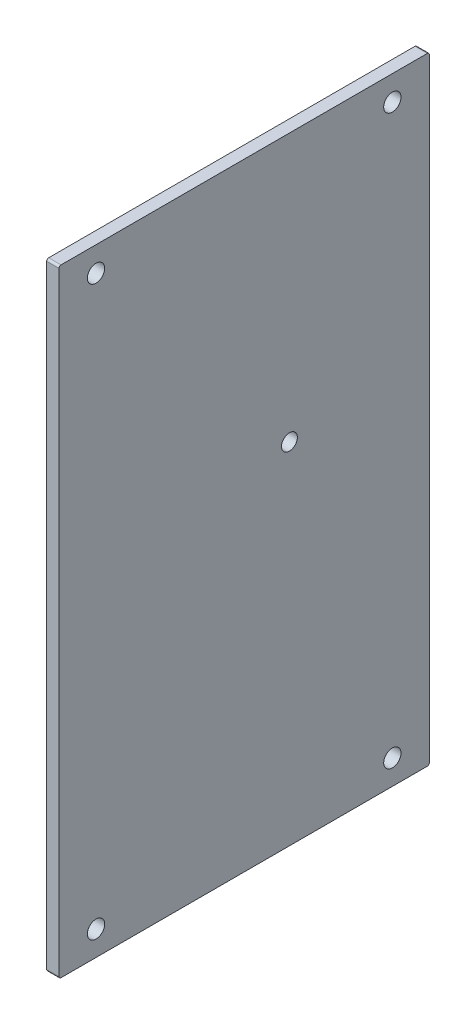
ISO-10303-21;
HEADER;
FILE_DESCRIPTION(('STEP AP214'),'2;1');
FILE_NAME('part.step','',(''),(''),'','','');
FILE_SCHEMA(('AUTOMOTIVE_DESIGN { 1 0 10303 214 1 1 1 1 }'));
ENDSEC;
DATA;
#1=APPLICATION_CONTEXT('core data for automotive mechanical design processes');
#2=APPLICATION_PROTOCOL_DEFINITION('international standard','automotive_design',2000,#1);
#3=PRODUCT_CONTEXT('',#1,'mechanical');
#4=PRODUCT('Part','Part','',(#3));
#5=PRODUCT_RELATED_PRODUCT_CATEGORY('part','',(#4));
#6=PRODUCT_DEFINITION_FORMATION('','',#4);
#7=PRODUCT_DEFINITION_CONTEXT('part definition',#1,'design');
#8=PRODUCT_DEFINITION('design','',#6,#7);
#9=PRODUCT_DEFINITION_SHAPE('','',#8);
#10=(LENGTH_UNIT() NAMED_UNIT(*) SI_UNIT(.MILLI.,.METRE.));
#11=(NAMED_UNIT(*) PLANE_ANGLE_UNIT() SI_UNIT($,.RADIAN.));
#12=(NAMED_UNIT(*) SI_UNIT($,.STERADIAN.) SOLID_ANGLE_UNIT());
#13=UNCERTAINTY_MEASURE_WITH_UNIT(LENGTH_MEASURE(1.E-05),#10,'distance_accuracy_value','');
#14=(GEOMETRIC_REPRESENTATION_CONTEXT(3) GLOBAL_UNCERTAINTY_ASSIGNED_CONTEXT((#13)) GLOBAL_UNIT_ASSIGNED_CONTEXT((#10,
#11,#12)) REPRESENTATION_CONTEXT('',''));
#15=CARTESIAN_POINT('',(0.,0.,0.));
#16=DIRECTION('',(0.,0.,1.));
#17=DIRECTION('',(1.,0.,0.));
#18=AXIS2_PLACEMENT_3D('',#15,#16,#17);
#19=CARTESIAN_POINT('',(3.,0.,0.));
#20=DIRECTION('',(1.,0.,0.));
#21=DIRECTION('',(0.,0.,-1.));
#22=AXIS2_PLACEMENT_3D('',#19,#20,#21);
#23=PLANE('',#22);
#24=CARTESIAN_POINT('',(3.,-144.,-81.));
#25=DIRECTION('',(1.,0.,0.));
#26=DIRECTION('',(0.,0.,-1.));
#27=AXIS2_PLACEMENT_3D('',#24,#25,#26);
#28=CIRCLE('',#27,2.09999999999999);
#29=CARTESIAN_POINT('',(3.,-144.,-83.1));
#30=VERTEX_POINT('',#29);
#31=EDGE_CURVE('E195',#30,#30,#28,.T.);
#32=ORIENTED_EDGE('',*,*,#31,.F.);
#33=EDGE_LOOP('',(#32));
#34=FACE_BOUND('',#33,.T.);
#35=CARTESIAN_POINT('',(3.,-6.,-9.));
#36=DIRECTION('',(1.,0.,0.));
#37=DIRECTION('',(0.,0.,-1.));
#38=AXIS2_PLACEMENT_3D('',#35,#36,#37);
#39=CIRCLE('',#38,2.1);
#40=CARTESIAN_POINT('',(3.,-6.,-11.1));
#41=VERTEX_POINT('',#40);
#42=EDGE_CURVE('E184',#41,#41,#39,.T.);
#43=ORIENTED_EDGE('',*,*,#42,.F.);
#44=EDGE_LOOP('',(#43));
#45=FACE_BOUND('',#44,.T.);
#46=DIRECTION('',(0.,0.,-1.));
#47=VECTOR('',#46,1.);
#48=CARTESIAN_POINT('',(3.,-150.,0.));
#49=LINE('',#48,#47);
#50=CARTESIAN_POINT('',(3.,-150.,-0.500000000000018));
#51=VERTEX_POINT('',#50);
#52=CARTESIAN_POINT('',(3.,-150.,-89.5));
#53=VERTEX_POINT('',#52);
#54=EDGE_CURVE('E169',#51,#53,#49,.T.);
#55=ORIENTED_EDGE('',*,*,#54,.T.);
#56=CARTESIAN_POINT('',(3.,-149.5,-89.5));
#57=DIRECTION('',(1.,0.,0.));
#58=DIRECTION('',(0.,0.,-1.));
#59=AXIS2_PLACEMENT_3D('',#56,#57,#58);
#60=CIRCLE('',#59,0.5);
#61=CARTESIAN_POINT('',(3.,-149.5,-90.));
#62=VERTEX_POINT('',#61);
#63=EDGE_CURVE('E149',#53,#62,#60,.T.);
#64=ORIENTED_EDGE('',*,*,#63,.T.);
#65=DIRECTION('',(0.,1.,0.));
#66=VECTOR('',#65,1.);
#67=CARTESIAN_POINT('',(3.,0.,-90.));
#68=LINE('',#67,#66);
#69=CARTESIAN_POINT('',(3.,-0.5,-90.));
#70=VERTEX_POINT('',#69);
#71=EDGE_CURVE('E119',#62,#70,#68,.T.);
#72=ORIENTED_EDGE('',*,*,#71,.T.);
#73=CARTESIAN_POINT('',(3.,-0.5,-89.5));
#74=DIRECTION('',(1.,0.,0.));
#75=DIRECTION('',(0.,0.,-1.));
#76=AXIS2_PLACEMENT_3D('',#73,#74,#75);
#77=CIRCLE('',#76,0.5);
#78=CARTESIAN_POINT('',(3.,0.,-89.5));
#79=VERTEX_POINT('',#78);
#80=EDGE_CURVE('E55',#70,#79,#77,.T.);
#81=ORIENTED_EDGE('',*,*,#80,.T.);
#82=DIRECTION('',(0.,0.,1.));
#83=VECTOR('',#82,1.);
#84=CARTESIAN_POINT('',(3.,0.,0.));
#85=LINE('',#84,#83);
#86=CARTESIAN_POINT('',(3.,0.,-0.5));
#87=VERTEX_POINT('',#86);
#88=EDGE_CURVE('E136',#79,#87,#85,.T.);
#89=ORIENTED_EDGE('',*,*,#88,.T.);
#90=CARTESIAN_POINT('',(3.,-0.5,-0.5));
#91=DIRECTION('',(1.,0.,0.));
#92=DIRECTION('',(0.,0.,-1.));
#93=AXIS2_PLACEMENT_3D('',#90,#91,#92);
#94=CIRCLE('',#93,0.5);
#95=CARTESIAN_POINT('',(3.,-0.5,0.));
#96=VERTEX_POINT('',#95);
#97=EDGE_CURVE('E144',#87,#96,#94,.T.);
#98=ORIENTED_EDGE('',*,*,#97,.T.);
#99=DIRECTION('',(0.,-1.,0.));
#100=VECTOR('',#99,1.);
#101=CARTESIAN_POINT('',(3.,0.,0.));
#102=LINE('',#101,#100);
#103=CARTESIAN_POINT('',(3.,-149.5,0.));
#104=VERTEX_POINT('',#103);
#105=EDGE_CURVE('E130',#96,#104,#102,.T.);
#106=ORIENTED_EDGE('',*,*,#105,.T.);
#107=CARTESIAN_POINT('',(3.,-149.5,-0.500000000000018));
#108=DIRECTION('',(1.,0.,0.));
#109=DIRECTION('',(0.,0.,-1.));
#110=AXIS2_PLACEMENT_3D('',#107,#108,#109);
#111=CIRCLE('',#110,0.5);
#112=EDGE_CURVE('E147',#104,#51,#111,.T.);
#113=ORIENTED_EDGE('',*,*,#112,.T.);
#114=EDGE_LOOP('',(#55,#64,#72,#81,#89,#98,#106,#113));
#115=FACE_BOUND('',#114,.T.);
#116=CARTESIAN_POINT('',(3.,-65.,-56.));
#117=DIRECTION('',(1.,0.,0.));
#118=DIRECTION('',(0.,0.,-1.));
#119=AXIS2_PLACEMENT_3D('',#116,#117,#118);
#120=CIRCLE('',#119,1.925);
#121=CARTESIAN_POINT('',(3.,-65.,-57.925));
#122=VERTEX_POINT('',#121);
#123=EDGE_CURVE('E175',#122,#122,#120,.T.);
#124=ORIENTED_EDGE('',*,*,#123,.F.);
#125=EDGE_LOOP('',(#124));
#126=FACE_BOUND('',#125,.T.);
#127=CARTESIAN_POINT('',(3.,-5.99999999999999,-81.));
#128=DIRECTION('',(1.,0.,0.));
#129=DIRECTION('',(0.,0.,1.));
#130=AXIS2_PLACEMENT_3D('',#127,#128,#129);
#131=CIRCLE('',#130,2.09999999999999);
#132=CARTESIAN_POINT('',(3.,-5.99999999999999,-78.9));
#133=VERTEX_POINT('',#132);
#134=EDGE_CURVE('E189',#133,#133,#131,.T.);
#135=ORIENTED_EDGE('',*,*,#134,.F.);
#136=EDGE_LOOP('',(#135));
#137=FACE_BOUND('',#136,.T.);
#138=CARTESIAN_POINT('',(3.,-144.,-9.));
#139=DIRECTION('',(1.,0.,0.));
#140=DIRECTION('',(0.,0.,1.));
#141=AXIS2_PLACEMENT_3D('',#138,#139,#140);
#142=CIRCLE('',#141,2.09999999999999);
#143=CARTESIAN_POINT('',(3.,-144.,-6.90000000000001));
#144=VERTEX_POINT('',#143);
#145=EDGE_CURVE('E201',#144,#144,#142,.T.);
#146=ORIENTED_EDGE('',*,*,#145,.F.);
#147=EDGE_LOOP('',(#146));
#148=FACE_BOUND('',#147,.T.);
#149=ADVANCED_FACE('F34',(#34,#45,#115,#126,#137,#148),#23,.T.);
#150=CARTESIAN_POINT('',(0.,0.,0.));
#151=DIRECTION('',(1.,0.,0.));
#152=DIRECTION('',(0.,0.,-1.));
#153=AXIS2_PLACEMENT_3D('',#150,#151,#152);
#154=PLANE('',#153);
#155=DIRECTION('',(0.,1.,0.));
#156=VECTOR('',#155,1.);
#157=CARTESIAN_POINT('',(0.,0.,-90.));
#158=LINE('',#157,#156);
#159=CARTESIAN_POINT('',(0.,-149.5,-90.));
#160=VERTEX_POINT('',#159);
#161=CARTESIAN_POINT('',(0.,-0.5,-90.));
#162=VERTEX_POINT('',#161);
#163=EDGE_CURVE('E117',#160,#162,#158,.T.);
#164=ORIENTED_EDGE('',*,*,#163,.F.);
#165=CARTESIAN_POINT('',(0.,-149.5,-89.5));
#166=DIRECTION('',(1.,0.,0.));
#167=DIRECTION('',(0.,0.,-1.));
#168=AXIS2_PLACEMENT_3D('',#165,#166,#167);
#169=CIRCLE('',#168,0.5);
#170=CARTESIAN_POINT('',(0.,-150.,-89.5));
#171=VERTEX_POINT('',#170);
#172=EDGE_CURVE('E100',#160,#171,#169,.F.);
#173=ORIENTED_EDGE('',*,*,#172,.T.);
#174=DIRECTION('',(0.,0.,-1.));
#175=VECTOR('',#174,1.);
#176=CARTESIAN_POINT('',(0.,-150.,0.));
#177=LINE('',#176,#175);
#178=CARTESIAN_POINT('',(0.,-150.,-0.500000000000018));
#179=VERTEX_POINT('',#178);
#180=EDGE_CURVE('E128',#179,#171,#177,.T.);
#181=ORIENTED_EDGE('',*,*,#180,.F.);
#182=CARTESIAN_POINT('',(0.,-149.5,-0.500000000000018));
#183=DIRECTION('',(1.,0.,0.));
#184=DIRECTION('',(0.,0.,-1.));
#185=AXIS2_PLACEMENT_3D('',#182,#183,#184);
#186=CIRCLE('',#185,0.5);
#187=CARTESIAN_POINT('',(0.,-149.5,0.));
#188=VERTEX_POINT('',#187);
#189=EDGE_CURVE('E111',#179,#188,#186,.F.);
#190=ORIENTED_EDGE('',*,*,#189,.T.);
#191=DIRECTION('',(0.,-1.,0.));
#192=VECTOR('',#191,1.);
#193=CARTESIAN_POINT('',(0.,0.,0.));
#194=LINE('',#193,#192);
#195=CARTESIAN_POINT('',(0.,-0.5,0.));
#196=VERTEX_POINT('',#195);
#197=EDGE_CURVE('E132',#196,#188,#194,.T.);
#198=ORIENTED_EDGE('',*,*,#197,.F.);
#199=CARTESIAN_POINT('',(0.,-0.5,-0.5));
#200=DIRECTION('',(1.,0.,0.));
#201=DIRECTION('',(0.,0.,-1.));
#202=AXIS2_PLACEMENT_3D('',#199,#200,#201);
#203=CIRCLE('',#202,0.5);
#204=CARTESIAN_POINT('',(0.,0.,-0.5));
#205=VERTEX_POINT('',#204);
#206=EDGE_CURVE('E120',#196,#205,#203,.F.);
#207=ORIENTED_EDGE('',*,*,#206,.T.);
#208=DIRECTION('',(0.,0.,1.));
#209=VECTOR('',#208,1.);
#210=CARTESIAN_POINT('',(0.,0.,0.));
#211=LINE('',#210,#209);
#212=CARTESIAN_POINT('',(0.,0.,-89.5));
#213=VERTEX_POINT('',#212);
#214=EDGE_CURVE('E127',#213,#205,#211,.T.);
#215=ORIENTED_EDGE('',*,*,#214,.F.);
#216=CARTESIAN_POINT('',(0.,-0.5,-89.5));
#217=DIRECTION('',(1.,0.,0.));
#218=DIRECTION('',(0.,0.,-1.));
#219=AXIS2_PLACEMENT_3D('',#216,#217,#218);
#220=CIRCLE('',#219,0.5);
#221=EDGE_CURVE('E126',#213,#162,#220,.F.);
#222=ORIENTED_EDGE('',*,*,#221,.T.);
#223=EDGE_LOOP('',(#164,#173,#181,#190,#198,#207,#215,#222));
#224=FACE_BOUND('',#223,.T.);
#225=CARTESIAN_POINT('',(0.,-65.,-56.));
#226=DIRECTION('',(1.,0.,0.));
#227=DIRECTION('',(0.,0.,-1.));
#228=AXIS2_PLACEMENT_3D('',#225,#226,#227);
#229=CIRCLE('',#228,1.925);
#230=CARTESIAN_POINT('',(0.,-65.,-57.925));
#231=VERTEX_POINT('',#230);
#232=EDGE_CURVE('E177',#231,#231,#229,.T.);
#233=ORIENTED_EDGE('',*,*,#232,.T.);
#234=EDGE_LOOP('',(#233));
#235=FACE_BOUND('',#234,.T.);
#236=CARTESIAN_POINT('',(0.,-6.,-9.));
#237=DIRECTION('',(1.,0.,0.));
#238=DIRECTION('',(0.,0.,-1.));
#239=AXIS2_PLACEMENT_3D('',#236,#237,#238);
#240=CIRCLE('',#239,2.1);
#241=CARTESIAN_POINT('',(0.,-6.,-11.1));
#242=VERTEX_POINT('',#241);
#243=EDGE_CURVE('E186',#242,#242,#240,.T.);
#244=ORIENTED_EDGE('',*,*,#243,.T.);
#245=EDGE_LOOP('',(#244));
#246=FACE_BOUND('',#245,.T.);
#247=CARTESIAN_POINT('',(0.,-5.99999999999999,-81.));
#248=DIRECTION('',(1.,0.,0.));
#249=DIRECTION('',(0.,0.,1.));
#250=AXIS2_PLACEMENT_3D('',#247,#248,#249);
#251=CIRCLE('',#250,2.09999999999999);
#252=CARTESIAN_POINT('',(0.,-5.99999999999999,-78.9));
#253=VERTEX_POINT('',#252);
#254=EDGE_CURVE('E192',#253,#253,#251,.T.);
#255=ORIENTED_EDGE('',*,*,#254,.T.);
#256=EDGE_LOOP('',(#255));
#257=FACE_BOUND('',#256,.T.);
#258=CARTESIAN_POINT('',(0.,-144.,-81.));
#259=DIRECTION('',(1.,0.,0.));
#260=DIRECTION('',(0.,0.,-1.));
#261=AXIS2_PLACEMENT_3D('',#258,#259,#260);
#262=CIRCLE('',#261,2.09999999999999);
#263=CARTESIAN_POINT('',(0.,-144.,-83.1));
#264=VERTEX_POINT('',#263);
#265=EDGE_CURVE('E198',#264,#264,#262,.T.);
#266=ORIENTED_EDGE('',*,*,#265,.T.);
#267=EDGE_LOOP('',(#266));
#268=FACE_BOUND('',#267,.T.);
#269=CARTESIAN_POINT('',(0.,-144.,-9.));
#270=DIRECTION('',(1.,0.,0.));
#271=DIRECTION('',(0.,0.,1.));
#272=AXIS2_PLACEMENT_3D('',#269,#270,#271);
#273=CIRCLE('',#272,2.09999999999999);
#274=CARTESIAN_POINT('',(0.,-144.,-6.90000000000001));
#275=VERTEX_POINT('',#274);
#276=EDGE_CURVE('E204',#275,#275,#273,.T.);
#277=ORIENTED_EDGE('',*,*,#276,.T.);
#278=EDGE_LOOP('',(#277));
#279=FACE_BOUND('',#278,.T.);
#280=ADVANCED_FACE('F123',(#224,#235,#246,#257,#268,#279),#154,.F.);
#281=CARTESIAN_POINT('',(3.,0.,0.));
#282=DIRECTION('',(0.,0.,-1.));
#283=DIRECTION('',(0.,1.,0.));
#284=AXIS2_PLACEMENT_3D('',#281,#282,#283);
#285=PLANE('',#284);
#286=ORIENTED_EDGE('',*,*,#197,.T.);
#287=DIRECTION('',(-1.,0.,0.));
#288=VECTOR('',#287,1.);
#289=CARTESIAN_POINT('',(3.,-149.5,0.));
#290=LINE('',#289,#288);
#291=EDGE_CURVE('E154',#188,#104,#290,.F.);
#292=ORIENTED_EDGE('',*,*,#291,.T.);
#293=ORIENTED_EDGE('',*,*,#105,.F.);
#294=DIRECTION('',(-1.,0.,0.));
#295=VECTOR('',#294,1.);
#296=CARTESIAN_POINT('',(3.,-0.5,0.));
#297=LINE('',#296,#295);
#298=EDGE_CURVE('E151',#96,#196,#297,.T.);
#299=ORIENTED_EDGE('',*,*,#298,.T.);
#300=EDGE_LOOP('',(#286,#292,#293,#299));
#301=FACE_BOUND('',#300,.T.);
#302=ADVANCED_FACE('F160',(#301),#285,.F.);
#303=CARTESIAN_POINT('',(3.,-150.,0.));
#304=DIRECTION('',(0.,1.,0.));
#305=DIRECTION('',(0.,0.,1.));
#306=AXIS2_PLACEMENT_3D('',#303,#304,#305);
#307=PLANE('',#306);
#308=ORIENTED_EDGE('',*,*,#180,.T.);
#309=DIRECTION('',(-1.,0.,0.));
#310=VECTOR('',#309,1.);
#311=CARTESIAN_POINT('',(3.,-150.,-89.5));
#312=LINE('',#311,#310);
#313=EDGE_CURVE('E105',#171,#53,#312,.F.);
#314=ORIENTED_EDGE('',*,*,#313,.T.);
#315=ORIENTED_EDGE('',*,*,#54,.F.);
#316=DIRECTION('',(-1.,0.,0.));
#317=VECTOR('',#316,1.);
#318=CARTESIAN_POINT('',(3.,-150.,-0.500000000000018));
#319=LINE('',#318,#317);
#320=EDGE_CURVE('E110',#51,#179,#319,.T.);
#321=ORIENTED_EDGE('',*,*,#320,.T.);
#322=EDGE_LOOP('',(#308,#314,#315,#321));
#323=FACE_BOUND('',#322,.T.);
#324=ADVANCED_FACE('F174',(#323),#307,.F.);
#325=CARTESIAN_POINT('',(3.,0.,-90.));
#326=DIRECTION('',(0.,0.,1.));
#327=DIRECTION('',(0.,-1.,0.));
#328=AXIS2_PLACEMENT_3D('',#325,#326,#327);
#329=PLANE('',#328);
#330=ORIENTED_EDGE('',*,*,#71,.F.);
#331=DIRECTION('',(-1.,0.,0.));
#332=VECTOR('',#331,1.);
#333=CARTESIAN_POINT('',(3.,-149.5,-90.));
#334=LINE('',#333,#332);
#335=EDGE_CURVE('E104',#62,#160,#334,.T.);
#336=ORIENTED_EDGE('',*,*,#335,.T.);
#337=ORIENTED_EDGE('',*,*,#163,.T.);
#338=DIRECTION('',(-1.,0.,0.));
#339=VECTOR('',#338,1.);
#340=CARTESIAN_POINT('',(3.,-0.5,-90.));
#341=LINE('',#340,#339);
#342=EDGE_CURVE('E121',#162,#70,#341,.F.);
#343=ORIENTED_EDGE('',*,*,#342,.T.);
#344=EDGE_LOOP('',(#330,#336,#337,#343));
#345=FACE_BOUND('',#344,.T.);
#346=ADVANCED_FACE('F116',(#345),#329,.F.);
#347=CARTESIAN_POINT('',(3.,0.,0.));
#348=DIRECTION('',(0.,-1.,0.));
#349=DIRECTION('',(0.,0.,-1.));
#350=AXIS2_PLACEMENT_3D('',#347,#348,#349);
#351=PLANE('',#350);
#352=ORIENTED_EDGE('',*,*,#88,.F.);
#353=DIRECTION('',(-1.,0.,0.));
#354=VECTOR('',#353,1.);
#355=CARTESIAN_POINT('',(3.,0.,-89.5));
#356=LINE('',#355,#354);
#357=EDGE_CURVE('E11',#79,#213,#356,.T.);
#358=ORIENTED_EDGE('',*,*,#357,.T.);
#359=ORIENTED_EDGE('',*,*,#214,.T.);
#360=DIRECTION('',(-1.,0.,0.));
#361=VECTOR('',#360,1.);
#362=CARTESIAN_POINT('',(3.,0.,-0.5));
#363=LINE('',#362,#361);
#364=EDGE_CURVE('E42',#205,#87,#363,.F.);
#365=ORIENTED_EDGE('',*,*,#364,.T.);
#366=EDGE_LOOP('',(#352,#358,#359,#365));
#367=FACE_BOUND('',#366,.T.);
#368=ADVANCED_FACE('F226',(#367),#351,.F.);
#369=CARTESIAN_POINT('',(3.,-65.,-56.));
#370=DIRECTION('',(-1.,0.,0.));
#371=DIRECTION('',(0.,0.,1.));
#372=AXIS2_PLACEMENT_3D('',#369,#370,#371);
#373=CYLINDRICAL_SURFACE('',#372,1.925);
#374=ORIENTED_EDGE('',*,*,#123,.T.);
#375=EDGE_LOOP('',(#374));
#376=FACE_BOUND('',#375,.T.);
#377=ORIENTED_EDGE('',*,*,#232,.F.);
#378=EDGE_LOOP('',(#377));
#379=FACE_BOUND('',#378,.T.);
#380=ADVANCED_FACE('F223',(#376,#379),#373,.F.);
#381=CARTESIAN_POINT('',(3.,-6.,-9.));
#382=DIRECTION('',(-1.,0.,0.));
#383=DIRECTION('',(0.,0.,1.));
#384=AXIS2_PLACEMENT_3D('',#381,#382,#383);
#385=CYLINDRICAL_SURFACE('',#384,2.1);
#386=ORIENTED_EDGE('',*,*,#42,.T.);
#387=EDGE_LOOP('',(#386));
#388=FACE_BOUND('',#387,.T.);
#389=ORIENTED_EDGE('',*,*,#243,.F.);
#390=EDGE_LOOP('',(#389));
#391=FACE_BOUND('',#390,.T.);
#392=ADVANCED_FACE('F328',(#388,#391),#385,.F.);
#393=CARTESIAN_POINT('',(3.,-5.99999999999999,-81.));
#394=DIRECTION('',(-1.,0.,0.));
#395=DIRECTION('',(0.,0.,1.));
#396=AXIS2_PLACEMENT_3D('',#393,#394,#395);
#397=CYLINDRICAL_SURFACE('',#396,2.09999999999999);
#398=ORIENTED_EDGE('',*,*,#134,.T.);
#399=EDGE_LOOP('',(#398));
#400=FACE_BOUND('',#399,.T.);
#401=ORIENTED_EDGE('',*,*,#254,.F.);
#402=EDGE_LOOP('',(#401));
#403=FACE_BOUND('',#402,.T.);
#404=ADVANCED_FACE('F318',(#400,#403),#397,.F.);
#405=CARTESIAN_POINT('',(3.,-144.,-81.));
#406=DIRECTION('',(-1.,0.,0.));
#407=DIRECTION('',(0.,0.,1.));
#408=AXIS2_PLACEMENT_3D('',#405,#406,#407);
#409=CYLINDRICAL_SURFACE('',#408,2.09999999999999);
#410=ORIENTED_EDGE('',*,*,#31,.T.);
#411=EDGE_LOOP('',(#410));
#412=FACE_BOUND('',#411,.T.);
#413=ORIENTED_EDGE('',*,*,#265,.F.);
#414=EDGE_LOOP('',(#413));
#415=FACE_BOUND('',#414,.T.);
#416=ADVANCED_FACE('F309',(#412,#415),#409,.F.);
#417=CARTESIAN_POINT('',(3.,-144.,-9.));
#418=DIRECTION('',(-1.,0.,0.));
#419=DIRECTION('',(0.,0.,1.));
#420=AXIS2_PLACEMENT_3D('',#417,#418,#419);
#421=CYLINDRICAL_SURFACE('',#420,2.09999999999999);
#422=ORIENTED_EDGE('',*,*,#145,.T.);
#423=EDGE_LOOP('',(#422));
#424=FACE_BOUND('',#423,.T.);
#425=ORIENTED_EDGE('',*,*,#276,.F.);
#426=EDGE_LOOP('',(#425));
#427=FACE_BOUND('',#426,.T.);
#428=ADVANCED_FACE('F210',(#424,#427),#421,.F.);
#429=CARTESIAN_POINT('',(3.,-149.5,-89.5));
#430=DIRECTION('',(-1.,0.,0.));
#431=DIRECTION('',(0.,0.,1.));
#432=AXIS2_PLACEMENT_3D('',#429,#430,#431);
#433=CYLINDRICAL_SURFACE('',#432,0.5);
#434=ORIENTED_EDGE('',*,*,#63,.F.);
#435=ORIENTED_EDGE('',*,*,#313,.F.);
#436=ORIENTED_EDGE('',*,*,#172,.F.);
#437=ORIENTED_EDGE('',*,*,#335,.F.);
#438=EDGE_LOOP('',(#434,#435,#436,#437));
#439=FACE_BOUND('',#438,.T.);
#440=ADVANCED_FACE('F103',(#439),#433,.T.);
#441=CARTESIAN_POINT('',(3.,-149.5,-0.500000000000018));
#442=DIRECTION('',(-1.,0.,0.));
#443=DIRECTION('',(0.,0.,1.));
#444=AXIS2_PLACEMENT_3D('',#441,#442,#443);
#445=CYLINDRICAL_SURFACE('',#444,0.5);
#446=ORIENTED_EDGE('',*,*,#112,.F.);
#447=ORIENTED_EDGE('',*,*,#291,.F.);
#448=ORIENTED_EDGE('',*,*,#189,.F.);
#449=ORIENTED_EDGE('',*,*,#320,.F.);
#450=EDGE_LOOP('',(#446,#447,#448,#449));
#451=FACE_BOUND('',#450,.T.);
#452=ADVANCED_FACE('F172',(#451),#445,.T.);
#453=CARTESIAN_POINT('',(3.,-0.5,-89.5));
#454=DIRECTION('',(-1.,0.,0.));
#455=DIRECTION('',(0.,0.,1.));
#456=AXIS2_PLACEMENT_3D('',#453,#454,#455);
#457=CYLINDRICAL_SURFACE('',#456,0.5);
#458=ORIENTED_EDGE('',*,*,#80,.F.);
#459=ORIENTED_EDGE('',*,*,#342,.F.);
#460=ORIENTED_EDGE('',*,*,#221,.F.);
#461=ORIENTED_EDGE('',*,*,#357,.F.);
#462=EDGE_LOOP('',(#458,#459,#460,#461));
#463=FACE_BOUND('',#462,.T.);
#464=ADVANCED_FACE('F238',(#463),#457,.T.);
#465=CARTESIAN_POINT('',(3.,-0.5,-0.5));
#466=DIRECTION('',(-1.,0.,0.));
#467=DIRECTION('',(0.,0.,1.));
#468=AXIS2_PLACEMENT_3D('',#465,#466,#467);
#469=CYLINDRICAL_SURFACE('',#468,0.5);
#470=ORIENTED_EDGE('',*,*,#97,.F.);
#471=ORIENTED_EDGE('',*,*,#364,.F.);
#472=ORIENTED_EDGE('',*,*,#206,.F.);
#473=ORIENTED_EDGE('',*,*,#298,.F.);
#474=EDGE_LOOP('',(#470,#471,#472,#473));
#475=FACE_BOUND('',#474,.T.);
#476=ADVANCED_FACE('F36',(#475),#469,.T.);
#477=CLOSED_SHELL('',(#149,#280,#302,#324,#346,#368,#380,#392,#404,#416,#428,#440,#452,#464,#476));
#478=MANIFOLD_SOLID_BREP('B2',#477);
#479=ADVANCED_BREP_SHAPE_REPRESENTATION('',(#18,#478),#14);
#480=SHAPE_DEFINITION_REPRESENTATION(#9,#479);
ENDSEC;
END-ISO-10303-21;
